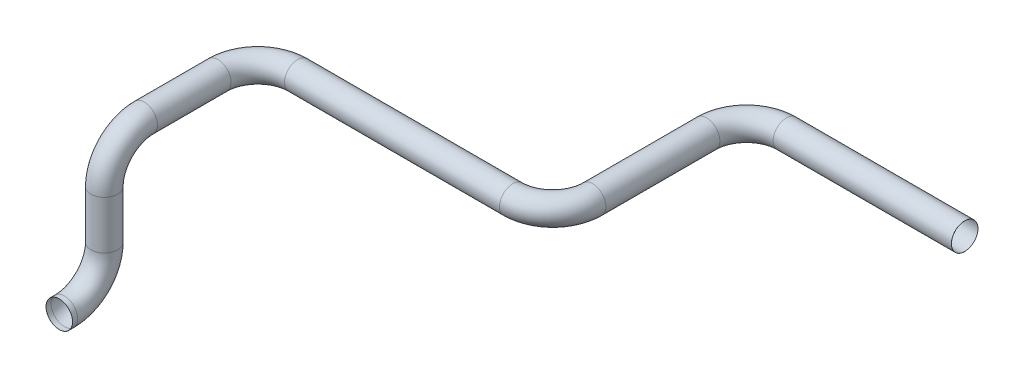
ISO-10303-21;
HEADER;
FILE_DESCRIPTION(('STEP AP214'),'2;1');
FILE_NAME('part.step','',(''),(''),'','','');
FILE_SCHEMA(('AUTOMOTIVE_DESIGN { 1 0 10303 214 1 1 1 1 }'));
ENDSEC;
DATA;
#1=APPLICATION_CONTEXT('core data for automotive mechanical design processes');
#2=APPLICATION_PROTOCOL_DEFINITION('international standard','automotive_design',2000,#1);
#3=PRODUCT_CONTEXT('',#1,'mechanical');
#4=PRODUCT('Part','Part','',(#3));
#5=PRODUCT_RELATED_PRODUCT_CATEGORY('part','',(#4));
#6=PRODUCT_DEFINITION_FORMATION('','',#4);
#7=PRODUCT_DEFINITION_CONTEXT('part definition',#1,'design');
#8=PRODUCT_DEFINITION('design','',#6,#7);
#9=PRODUCT_DEFINITION_SHAPE('','',#8);
#10=(LENGTH_UNIT() NAMED_UNIT(*) SI_UNIT(.MILLI.,.METRE.));
#11=(NAMED_UNIT(*) PLANE_ANGLE_UNIT() SI_UNIT($,.RADIAN.));
#12=(NAMED_UNIT(*) SI_UNIT($,.STERADIAN.) SOLID_ANGLE_UNIT());
#13=UNCERTAINTY_MEASURE_WITH_UNIT(LENGTH_MEASURE(1.E-05),#10,'distance_accuracy_value','');
#14=(GEOMETRIC_REPRESENTATION_CONTEXT(3) GLOBAL_UNCERTAINTY_ASSIGNED_CONTEXT((#13)) GLOBAL_UNIT_ASSIGNED_CONTEXT((#10,
#11,#12)) REPRESENTATION_CONTEXT('',''));
#15=CARTESIAN_POINT('',(0.,0.,0.));
#16=DIRECTION('',(0.,0.,1.));
#17=DIRECTION('',(1.,0.,0.));
#18=AXIS2_PLACEMENT_3D('',#15,#16,#17);
#19=CARTESIAN_POINT('',(0.,0.,0.));
#20=DIRECTION('',(0.,0.,1.));
#21=DIRECTION('',(1.,0.,0.));
#22=AXIS2_PLACEMENT_3D('',#19,#20,#21);
#23=PLANE('',#22);
#24=CARTESIAN_POINT('',(0.,0.,0.));
#25=DIRECTION('',(0.,0.,1.));
#26=DIRECTION('',(1.,0.,0.));
#27=AXIS2_PLACEMENT_3D('',#24,#25,#26);
#28=CIRCLE('',#27,4.99);
#29=CARTESIAN_POINT('',(4.99,0.,0.));
#30=VERTEX_POINT('',#29);
#31=EDGE_CURVE('E96',#30,#30,#28,.T.);
#32=ORIENTED_EDGE('',*,*,#31,.F.);
#33=EDGE_LOOP('',(#32));
#34=FACE_BOUND('',#33,.T.);
#35=CARTESIAN_POINT('',(0.,0.,0.));
#36=DIRECTION('',(0.,0.,1.));
#37=DIRECTION('',(1.,0.,0.));
#38=AXIS2_PLACEMENT_3D('',#35,#36,#37);
#39=CIRCLE('',#38,5.);
#40=CARTESIAN_POINT('',(5.,0.,0.));
#41=VERTEX_POINT('',#40);
#42=EDGE_CURVE('E89',#41,#41,#39,.T.);
#43=ORIENTED_EDGE('',*,*,#42,.T.);
#44=EDGE_LOOP('',(#43));
#45=FACE_BOUND('',#44,.T.);
#46=ADVANCED_FACE('F49',(#34,#45),#23,.T.);
#47=CARTESIAN_POINT('',(192.816056144563,48.1054397973253,-147.422083171506));
#48=DIRECTION('',(-1.,0.,0.));
#49=DIRECTION('',(0.,0.,1.));
#50=AXIS2_PLACEMENT_3D('',#47,#48,#49);
#51=PLANE('',#50);
#52=CARTESIAN_POINT('',(192.816056144563,48.1054397973253,-147.422083171506));
#53=DIRECTION('',(-1.,0.,0.));
#54=DIRECTION('',(0.,0.,1.));
#55=AXIS2_PLACEMENT_3D('',#52,#53,#54);
#56=CIRCLE('',#55,4.99);
#57=CARTESIAN_POINT('',(192.816056144563,48.1054397973253,-142.432083171506));
#58=VERTEX_POINT('',#57);
#59=EDGE_CURVE('E92',#58,#58,#56,.T.);
#60=ORIENTED_EDGE('',*,*,#59,.T.);
#61=EDGE_LOOP('',(#60));
#62=FACE_BOUND('',#61,.T.);
#63=CARTESIAN_POINT('',(192.816056144563,48.1054397973253,-147.422083171506));
#64=DIRECTION('',(-1.,0.,0.));
#65=DIRECTION('',(0.,0.,1.));
#66=AXIS2_PLACEMENT_3D('',#63,#64,#65);
#67=CIRCLE('',#66,5.);
#68=CARTESIAN_POINT('',(192.816056144563,48.1054397973253,-142.422083171506));
#69=VERTEX_POINT('',#68);
#70=EDGE_CURVE('E11',#69,#69,#67,.T.);
#71=ORIENTED_EDGE('',*,*,#70,.F.);
#72=EDGE_LOOP('',(#71));
#73=FACE_BOUND('',#72,.T.);
#74=ADVANCED_FACE('F140',(#62,#73),#51,.F.);
#75=CARTESIAN_POINT('',(0.,0.,0.));
#76=DIRECTION('',(0.,0.,-1.));
#77=DIRECTION('',(-1.,0.,0.));
#78=AXIS2_PLACEMENT_3D('',#75,#76,#77);
#79=CYLINDRICAL_SURFACE('',#78,5.);
#80=CARTESIAN_POINT('',(0.,0.,-1.91420702448455));
#81=DIRECTION('',(0.,0.,1.));
#82=DIRECTION('',(1.,0.,0.));
#83=AXIS2_PLACEMENT_3D('',#80,#81,#82);
#84=CIRCLE('',#83,5.);
#85=CARTESIAN_POINT('',(0.,-5.,-1.91420702448456));
#86=VERTEX_POINT('',#85);
#87=EDGE_CURVE('E86',#86,#86,#84,.T.);
#88=ORIENTED_EDGE('',*,*,#87,.T.);
#89=EDGE_LOOP('',(#88));
#90=FACE_BOUND('',#89,.T.);
#91=ORIENTED_EDGE('',*,*,#42,.F.);
#92=EDGE_LOOP('',(#91));
#93=FACE_BOUND('',#92,.T.);
#94=ADVANCED_FACE('F144',(#90,#93),#79,.T.);
#95=CARTESIAN_POINT('',(0.,15.,-1.91420702448454));
#96=DIRECTION('',(1.,0.,0.));
#97=DIRECTION('',(0.,0.,-1.));
#98=AXIS2_PLACEMENT_3D('',#95,#96,#97);
#99=TOROIDAL_SURFACE('',#98,15.,5.);
#100=CARTESIAN_POINT('',(0.,15.,-16.9142070244845));
#101=DIRECTION('',(0.,-1.,0.));
#102=DIRECTION('',(1.,0.,0.));
#103=AXIS2_PLACEMENT_3D('',#100,#101,#102);
#104=CIRCLE('',#103,5.);
#105=CARTESIAN_POINT('',(0.,15.,-21.9142070244845));
#106=VERTEX_POINT('',#105);
#107=EDGE_CURVE('E83',#106,#106,#104,.T.);
#108=CARTESIAN_POINT('',(0.,15.,-1.91420702448454));
#109=DIRECTION('',(1.,0.,0.));
#110=DIRECTION('',(0.,0.,-1.));
#111=AXIS2_PLACEMENT_3D('',#108,#109,#110);
#112=CIRCLE('',#111,20.);
#113=EDGE_CURVE('',#86,#106,#112,.T.);
#114=ORIENTED_EDGE('',*,*,#87,.F.);
#115=ORIENTED_EDGE('',*,*,#107,.T.);
#116=ORIENTED_EDGE('',*,*,#113,.T.);
#117=ORIENTED_EDGE('',*,*,#113,.F.);
#118=EDGE_LOOP('',(#114,#116,#115,#117));
#119=FACE_BOUND('',#118,.T.);
#120=ADVANCED_FACE('F146',(#119),#99,.T.);
#121=CARTESIAN_POINT('',(0.,15.,-16.9142070244845));
#122=DIRECTION('',(0.,1.,0.));
#123=DIRECTION('',(0.,0.,1.));
#124=AXIS2_PLACEMENT_3D('',#121,#122,#123);
#125=CYLINDRICAL_SURFACE('',#124,5.);
#126=CARTESIAN_POINT('',(0.,33.1054397973253,-16.9142070244845));
#127=DIRECTION('',(0.,-1.,0.));
#128=DIRECTION('',(1.,0.,0.));
#129=AXIS2_PLACEMENT_3D('',#126,#127,#128);
#130=CIRCLE('',#129,5.);
#131=CARTESIAN_POINT('',(0.,33.1054397973253,-11.9142070244845));
#132=VERTEX_POINT('',#131);
#133=EDGE_CURVE('E80',#132,#132,#130,.T.);
#134=ORIENTED_EDGE('',*,*,#133,.T.);
#135=EDGE_LOOP('',(#134));
#136=FACE_BOUND('',#135,.T.);
#137=ORIENTED_EDGE('',*,*,#107,.F.);
#138=EDGE_LOOP('',(#137));
#139=FACE_BOUND('',#138,.T.);
#140=ADVANCED_FACE('F152',(#136,#139),#125,.T.);
#141=CARTESIAN_POINT('',(0.,33.1054397973253,-31.9142070244845));
#142=DIRECTION('',(-1.,0.,0.));
#143=DIRECTION('',(0.,0.,1.));
#144=AXIS2_PLACEMENT_3D('',#141,#142,#143);
#145=TOROIDAL_SURFACE('',#144,15.,5.);
#146=CARTESIAN_POINT('',(0.,48.1054397973253,-31.9142070244846));
#147=DIRECTION('',(0.,0.,1.));
#148=DIRECTION('',(1.,0.,0.));
#149=AXIS2_PLACEMENT_3D('',#146,#147,#148);
#150=CIRCLE('',#149,5.);
#151=CARTESIAN_POINT('',(0.,53.1054397973253,-31.9142070244846));
#152=VERTEX_POINT('',#151);
#153=EDGE_CURVE('E77',#152,#152,#150,.T.);
#154=CARTESIAN_POINT('',(0.,33.1054397973253,-31.9142070244845));
#155=DIRECTION('',(-1.,0.,0.));
#156=DIRECTION('',(0.,0.,1.));
#157=AXIS2_PLACEMENT_3D('',#154,#155,#156);
#158=CIRCLE('',#157,20.);
#159=EDGE_CURVE('',#132,#152,#158,.T.);
#160=ORIENTED_EDGE('',*,*,#133,.F.);
#161=ORIENTED_EDGE('',*,*,#153,.T.);
#162=ORIENTED_EDGE('',*,*,#159,.T.);
#163=ORIENTED_EDGE('',*,*,#159,.F.);
#164=EDGE_LOOP('',(#160,#162,#161,#163));
#165=FACE_BOUND('',#164,.T.);
#166=ADVANCED_FACE('F186',(#165),#145,.T.);
#167=CARTESIAN_POINT('',(0.,48.1054397973253,-31.9142070244846));
#168=DIRECTION('',(0.,0.,-1.));
#169=DIRECTION('',(-1.,0.,0.));
#170=AXIS2_PLACEMENT_3D('',#167,#168,#169);
#171=CYLINDRICAL_SURFACE('',#170,5.);
#172=CARTESIAN_POINT('',(0.,48.1054397973253,-59.6010028769888));
#173=DIRECTION('',(0.,0.,1.));
#174=DIRECTION('',(1.,0.,0.));
#175=AXIS2_PLACEMENT_3D('',#172,#173,#174);
#176=CIRCLE('',#175,5.);
#177=CARTESIAN_POINT('',(-5.,48.1054397973253,-59.6010028769888));
#178=VERTEX_POINT('',#177);
#179=EDGE_CURVE('E74',#178,#178,#176,.T.);
#180=ORIENTED_EDGE('',*,*,#179,.T.);
#181=EDGE_LOOP('',(#180));
#182=FACE_BOUND('',#181,.T.);
#183=ORIENTED_EDGE('',*,*,#153,.F.);
#184=EDGE_LOOP('',(#183));
#185=FACE_BOUND('',#184,.T.);
#186=ADVANCED_FACE('F182',(#182,#185),#171,.T.);
#187=CARTESIAN_POINT('',(15.,48.1054397973253,-59.6010028769888));
#188=DIRECTION('',(0.,-1.,0.));
#189=DIRECTION('',(0.,0.,-1.));
#190=AXIS2_PLACEMENT_3D('',#187,#188,#189);
#191=TOROIDAL_SURFACE('',#190,15.,5.);
#192=CARTESIAN_POINT('',(15.,48.1054397973253,-74.6010028769888));
#193=DIRECTION('',(-1.,0.,0.));
#194=DIRECTION('',(0.,0.,1.));
#195=AXIS2_PLACEMENT_3D('',#192,#193,#194);
#196=CIRCLE('',#195,5.);
#197=CARTESIAN_POINT('',(15.,48.1054397973253,-79.6010028769888));
#198=VERTEX_POINT('',#197);
#199=EDGE_CURVE('E71',#198,#198,#196,.T.);
#200=CARTESIAN_POINT('',(15.,48.1054397973253,-59.6010028769888));
#201=DIRECTION('',(0.,-1.,0.));
#202=DIRECTION('',(0.,0.,-1.));
#203=AXIS2_PLACEMENT_3D('',#200,#201,#202);
#204=CIRCLE('',#203,20.);
#205=EDGE_CURVE('',#178,#198,#204,.T.);
#206=ORIENTED_EDGE('',*,*,#179,.F.);
#207=ORIENTED_EDGE('',*,*,#199,.T.);
#208=ORIENTED_EDGE('',*,*,#205,.T.);
#209=ORIENTED_EDGE('',*,*,#205,.F.);
#210=EDGE_LOOP('',(#206,#208,#207,#209));
#211=FACE_BOUND('',#210,.T.);
#212=ADVANCED_FACE('F178',(#211),#191,.T.);
#213=CARTESIAN_POINT('',(15.,48.1054397973253,-74.6010028769888));
#214=DIRECTION('',(1.,0.,0.));
#215=DIRECTION('',(0.,0.,-1.));
#216=AXIS2_PLACEMENT_3D('',#213,#214,#215);
#217=CYLINDRICAL_SURFACE('',#216,5.);
#218=CARTESIAN_POINT('',(95.8233031125536,48.1054397973253,-74.6010028769888));
#219=DIRECTION('',(-1.,0.,0.));
#220=DIRECTION('',(0.,0.,1.));
#221=AXIS2_PLACEMENT_3D('',#218,#219,#220);
#222=CIRCLE('',#221,5.);
#223=CARTESIAN_POINT('',(95.8233031125536,48.1054397973253,-69.6010028769888));
#224=VERTEX_POINT('',#223);
#225=EDGE_CURVE('E68',#224,#224,#222,.T.);
#226=ORIENTED_EDGE('',*,*,#225,.T.);
#227=EDGE_LOOP('',(#226));
#228=FACE_BOUND('',#227,.T.);
#229=ORIENTED_EDGE('',*,*,#199,.F.);
#230=EDGE_LOOP('',(#229));
#231=FACE_BOUND('',#230,.T.);
#232=ADVANCED_FACE('F174',(#228,#231),#217,.T.);
#233=CARTESIAN_POINT('',(95.8233031125536,48.1054397973253,-89.6010028769888));
#234=DIRECTION('',(0.,1.,0.));
#235=DIRECTION('',(0.,0.,1.));
#236=AXIS2_PLACEMENT_3D('',#233,#234,#235);
#237=TOROIDAL_SURFACE('',#236,15.,5.);
#238=CARTESIAN_POINT('',(110.823303112554,48.1054397973253,-89.6010028769888));
#239=DIRECTION('',(0.,0.,1.));
#240=DIRECTION('',(1.,0.,0.));
#241=AXIS2_PLACEMENT_3D('',#238,#239,#240);
#242=CIRCLE('',#241,5.);
#243=CARTESIAN_POINT('',(115.823303112554,48.1054397973253,-89.6010028769888));
#244=VERTEX_POINT('',#243);
#245=EDGE_CURVE('E63',#244,#244,#242,.T.);
#246=CARTESIAN_POINT('',(95.8233031125536,48.1054397973253,-89.6010028769888));
#247=DIRECTION('',(0.,1.,0.));
#248=DIRECTION('',(0.,0.,1.));
#249=AXIS2_PLACEMENT_3D('',#246,#247,#248);
#250=CIRCLE('',#249,20.);
#251=EDGE_CURVE('',#224,#244,#250,.T.);
#252=ORIENTED_EDGE('',*,*,#225,.F.);
#253=ORIENTED_EDGE('',*,*,#245,.T.);
#254=ORIENTED_EDGE('',*,*,#251,.T.);
#255=ORIENTED_EDGE('',*,*,#251,.F.);
#256=EDGE_LOOP('',(#252,#254,#253,#255));
#257=FACE_BOUND('',#256,.T.);
#258=ADVANCED_FACE('F170',(#257),#237,.T.);
#259=CARTESIAN_POINT('',(110.823303112554,48.1054397973253,-89.6010028769888));
#260=DIRECTION('',(0.,0.,-1.));
#261=DIRECTION('',(-1.,0.,0.));
#262=AXIS2_PLACEMENT_3D('',#259,#260,#261);
#263=CYLINDRICAL_SURFACE('',#262,5.);
#264=CARTESIAN_POINT('',(110.823303112554,48.1054397973253,-132.422083171506));
#265=DIRECTION('',(0.,0.,1.));
#266=DIRECTION('',(1.,0.,0.));
#267=AXIS2_PLACEMENT_3D('',#264,#265,#266);
#268=CIRCLE('',#267,5.);
#269=CARTESIAN_POINT('',(105.823303112554,48.1054397973253,-132.422083171506));
#270=VERTEX_POINT('',#269);
#271=EDGE_CURVE('E59',#270,#270,#268,.T.);
#272=ORIENTED_EDGE('',*,*,#271,.T.);
#273=EDGE_LOOP('',(#272));
#274=FACE_BOUND('',#273,.T.);
#275=ORIENTED_EDGE('',*,*,#245,.F.);
#276=EDGE_LOOP('',(#275));
#277=FACE_BOUND('',#276,.T.);
#278=ADVANCED_FACE('F164',(#274,#277),#263,.T.);
#279=CARTESIAN_POINT('',(125.823303112554,48.1054397973253,-132.422083171506));
#280=DIRECTION('',(0.,-1.,0.));
#281=DIRECTION('',(0.,0.,-1.));
#282=AXIS2_PLACEMENT_3D('',#279,#280,#281);
#283=TOROIDAL_SURFACE('',#282,15.,5.);
#284=CARTESIAN_POINT('',(125.823303112554,48.1054397973253,-147.422083171506));
#285=DIRECTION('',(-1.,0.,0.));
#286=DIRECTION('',(0.,0.,1.));
#287=AXIS2_PLACEMENT_3D('',#284,#285,#286);
#288=CIRCLE('',#287,5.);
#289=CARTESIAN_POINT('',(125.823303112554,48.1054397973253,-152.422083171506));
#290=VERTEX_POINT('',#289);
#291=EDGE_CURVE('E55',#290,#290,#288,.T.);
#292=CARTESIAN_POINT('',(125.823303112554,48.1054397973253,-132.422083171506));
#293=DIRECTION('',(0.,-1.,0.));
#294=DIRECTION('',(0.,0.,-1.));
#295=AXIS2_PLACEMENT_3D('',#292,#293,#294);
#296=CIRCLE('',#295,20.);
#297=EDGE_CURVE('',#270,#290,#296,.T.);
#298=ORIENTED_EDGE('',*,*,#271,.F.);
#299=ORIENTED_EDGE('',*,*,#291,.T.);
#300=ORIENTED_EDGE('',*,*,#297,.T.);
#301=ORIENTED_EDGE('',*,*,#297,.F.);
#302=EDGE_LOOP('',(#298,#300,#299,#301));
#303=FACE_BOUND('',#302,.T.);
#304=ADVANCED_FACE('F159',(#303),#283,.T.);
#305=CARTESIAN_POINT('',(125.823303112554,48.1054397973253,-147.422083171506));
#306=DIRECTION('',(1.,0.,0.));
#307=DIRECTION('',(0.,0.,-1.));
#308=AXIS2_PLACEMENT_3D('',#305,#306,#307);
#309=CYLINDRICAL_SURFACE('',#308,5.);
#310=ORIENTED_EDGE('',*,*,#70,.T.);
#311=EDGE_LOOP('',(#310));
#312=FACE_BOUND('',#311,.T.);
#313=ORIENTED_EDGE('',*,*,#291,.F.);
#314=EDGE_LOOP('',(#313));
#315=FACE_BOUND('',#314,.T.);
#316=ADVANCED_FACE('F134',(#312,#315),#309,.T.);
#317=CARTESIAN_POINT('',(0.,0.,0.));
#318=DIRECTION('',(0.,0.,-1.));
#319=DIRECTION('',(-1.,0.,0.));
#320=AXIS2_PLACEMENT_3D('',#317,#318,#319);
#321=CYLINDRICAL_SURFACE('',#320,4.99);
#322=CARTESIAN_POINT('',(0.,0.,-1.91420702448455));
#323=DIRECTION('',(0.,0.,-1.));
#324=DIRECTION('',(-1.,0.,0.));
#325=AXIS2_PLACEMENT_3D('',#322,#323,#324);
#326=CIRCLE('',#325,4.99);
#327=CARTESIAN_POINT('',(0.,-4.99,-1.91420702448456));
#328=VERTEX_POINT('',#327);
#329=EDGE_CURVE('E99',#328,#328,#326,.F.);
#330=ORIENTED_EDGE('',*,*,#329,.F.);
#331=EDGE_LOOP('',(#330));
#332=FACE_BOUND('',#331,.T.);
#333=ORIENTED_EDGE('',*,*,#31,.T.);
#334=EDGE_LOOP('',(#333));
#335=FACE_BOUND('',#334,.T.);
#336=ADVANCED_FACE('F131',(#332,#335),#321,.F.);
#337=CARTESIAN_POINT('',(0.,15.,-1.91420702448454));
#338=DIRECTION('',(1.,0.,0.));
#339=DIRECTION('',(0.,0.,-1.));
#340=AXIS2_PLACEMENT_3D('',#337,#338,#339);
#341=TOROIDAL_SURFACE('',#340,15.,4.99);
#342=CARTESIAN_POINT('',(0.,15.,-16.9142070244845));
#343=DIRECTION('',(0.,-1.,0.));
#344=DIRECTION('',(0.,0.,-1.));
#345=AXIS2_PLACEMENT_3D('',#342,#343,#344);
#346=CIRCLE('',#345,4.99);
#347=CARTESIAN_POINT('',(0.,15.,-21.9042070244845));
#348=VERTEX_POINT('',#347);
#349=EDGE_CURVE('E123',#348,#348,#346,.T.);
#350=CARTESIAN_POINT('',(0.,15.,-1.91420702448454));
#351=DIRECTION('',(1.,0.,0.));
#352=DIRECTION('',(0.,0.,-1.));
#353=AXIS2_PLACEMENT_3D('',#350,#351,#352);
#354=CIRCLE('',#353,19.99);
#355=EDGE_CURVE('',#328,#348,#354,.T.);
#356=ORIENTED_EDGE('',*,*,#329,.T.);
#357=ORIENTED_EDGE('',*,*,#349,.F.);
#358=ORIENTED_EDGE('',*,*,#355,.T.);
#359=ORIENTED_EDGE('',*,*,#355,.F.);
#360=EDGE_LOOP('',(#356,#358,#357,#359));
#361=FACE_BOUND('',#360,.T.);
#362=ADVANCED_FACE('F129',(#361),#341,.F.);
#363=CARTESIAN_POINT('',(0.,15.,-16.9142070244845));
#364=DIRECTION('',(0.,1.,0.));
#365=DIRECTION('',(0.,0.,1.));
#366=AXIS2_PLACEMENT_3D('',#363,#364,#365);
#367=CYLINDRICAL_SURFACE('',#366,4.99);
#368=CARTESIAN_POINT('',(0.,33.1054397973253,-16.9142070244845));
#369=DIRECTION('',(0.,1.,0.));
#370=DIRECTION('',(0.,0.,1.));
#371=AXIS2_PLACEMENT_3D('',#368,#369,#370);
#372=CIRCLE('',#371,4.99);
#373=CARTESIAN_POINT('',(0.,33.1054397973253,-11.9242070244845));
#374=VERTEX_POINT('',#373);
#375=EDGE_CURVE('E120',#374,#374,#372,.F.);
#376=ORIENTED_EDGE('',*,*,#375,.F.);
#377=EDGE_LOOP('',(#376));
#378=FACE_BOUND('',#377,.T.);
#379=ORIENTED_EDGE('',*,*,#349,.T.);
#380=EDGE_LOOP('',(#379));
#381=FACE_BOUND('',#380,.T.);
#382=ADVANCED_FACE('F258',(#378,#381),#367,.F.);
#383=CARTESIAN_POINT('',(0.,33.1054397973253,-31.9142070244845));
#384=DIRECTION('',(-1.,0.,0.));
#385=DIRECTION('',(0.,0.,1.));
#386=AXIS2_PLACEMENT_3D('',#383,#384,#385);
#387=TOROIDAL_SURFACE('',#386,15.,4.99);
#388=CARTESIAN_POINT('',(0.,48.1054397973253,-31.9142070244846));
#389=DIRECTION('',(0.,0.,1.));
#390=DIRECTION('',(0.,-1.,0.));
#391=AXIS2_PLACEMENT_3D('',#388,#389,#390);
#392=CIRCLE('',#391,4.99);
#393=CARTESIAN_POINT('',(0.,53.0954397973253,-31.9142070244846));
#394=VERTEX_POINT('',#393);
#395=EDGE_CURVE('E117',#394,#394,#392,.T.);
#396=CARTESIAN_POINT('',(0.,33.1054397973253,-31.9142070244845));
#397=DIRECTION('',(-1.,0.,0.));
#398=DIRECTION('',(0.,0.,1.));
#399=AXIS2_PLACEMENT_3D('',#396,#397,#398);
#400=CIRCLE('',#399,19.99);
#401=EDGE_CURVE('',#374,#394,#400,.T.);
#402=ORIENTED_EDGE('',*,*,#375,.T.);
#403=ORIENTED_EDGE('',*,*,#395,.F.);
#404=ORIENTED_EDGE('',*,*,#401,.T.);
#405=ORIENTED_EDGE('',*,*,#401,.F.);
#406=EDGE_LOOP('',(#402,#404,#403,#405));
#407=FACE_BOUND('',#406,.T.);
#408=ADVANCED_FACE('F268',(#407),#387,.F.);
#409=CARTESIAN_POINT('',(0.,48.1054397973253,-31.9142070244846));
#410=DIRECTION('',(0.,0.,-1.));
#411=DIRECTION('',(-1.,0.,0.));
#412=AXIS2_PLACEMENT_3D('',#409,#410,#411);
#413=CYLINDRICAL_SURFACE('',#412,4.99);
#414=CARTESIAN_POINT('',(0.,48.1054397973253,-59.6010028769888));
#415=DIRECTION('',(0.,0.,-1.));
#416=DIRECTION('',(-1.,0.,0.));
#417=AXIS2_PLACEMENT_3D('',#414,#415,#416);
#418=CIRCLE('',#417,4.99);
#419=CARTESIAN_POINT('',(-4.99,48.1054397973253,-59.6010028769888));
#420=VERTEX_POINT('',#419);
#421=EDGE_CURVE('E114',#420,#420,#418,.F.);
#422=ORIENTED_EDGE('',*,*,#421,.F.);
#423=EDGE_LOOP('',(#422));
#424=FACE_BOUND('',#423,.T.);
#425=ORIENTED_EDGE('',*,*,#395,.T.);
#426=EDGE_LOOP('',(#425));
#427=FACE_BOUND('',#426,.T.);
#428=ADVANCED_FACE('F278',(#424,#427),#413,.F.);
#429=CARTESIAN_POINT('',(15.,48.1054397973253,-59.6010028769888));
#430=DIRECTION('',(0.,-1.,0.));
#431=DIRECTION('',(0.,0.,-1.));
#432=AXIS2_PLACEMENT_3D('',#429,#430,#431);
#433=TOROIDAL_SURFACE('',#432,15.,4.99);
#434=CARTESIAN_POINT('',(15.,48.1054397973253,-74.6010028769888));
#435=DIRECTION('',(-1.,0.,0.));
#436=DIRECTION('',(0.,0.,1.));
#437=AXIS2_PLACEMENT_3D('',#434,#435,#436);
#438=CIRCLE('',#437,4.99);
#439=CARTESIAN_POINT('',(15.,48.1054397973253,-79.5910028769888));
#440=VERTEX_POINT('',#439);
#441=EDGE_CURVE('E111',#440,#440,#438,.T.);
#442=CARTESIAN_POINT('',(15.,48.1054397973253,-59.6010028769888));
#443=DIRECTION('',(0.,-1.,0.));
#444=DIRECTION('',(0.,0.,-1.));
#445=AXIS2_PLACEMENT_3D('',#442,#443,#444);
#446=CIRCLE('',#445,19.99);
#447=EDGE_CURVE('',#420,#440,#446,.T.);
#448=ORIENTED_EDGE('',*,*,#421,.T.);
#449=ORIENTED_EDGE('',*,*,#441,.F.);
#450=ORIENTED_EDGE('',*,*,#447,.T.);
#451=ORIENTED_EDGE('',*,*,#447,.F.);
#452=EDGE_LOOP('',(#448,#450,#449,#451));
#453=FACE_BOUND('',#452,.T.);
#454=ADVANCED_FACE('F288',(#453),#433,.F.);
#455=CARTESIAN_POINT('',(15.,48.1054397973253,-74.6010028769888));
#456=DIRECTION('',(1.,0.,0.));
#457=DIRECTION('',(0.,0.,-1.));
#458=AXIS2_PLACEMENT_3D('',#455,#456,#457);
#459=CYLINDRICAL_SURFACE('',#458,4.99);
#460=CARTESIAN_POINT('',(95.8233031125536,48.1054397973253,-74.6010028769888));
#461=DIRECTION('',(1.,0.,0.));
#462=DIRECTION('',(0.,0.,-1.));
#463=AXIS2_PLACEMENT_3D('',#460,#461,#462);
#464=CIRCLE('',#463,4.99);
#465=CARTESIAN_POINT('',(95.8233031125536,48.1054397973253,-69.6110028769888));
#466=VERTEX_POINT('',#465);
#467=EDGE_CURVE('E108',#466,#466,#464,.F.);
#468=ORIENTED_EDGE('',*,*,#467,.F.);
#469=EDGE_LOOP('',(#468));
#470=FACE_BOUND('',#469,.T.);
#471=ORIENTED_EDGE('',*,*,#441,.T.);
#472=EDGE_LOOP('',(#471));
#473=FACE_BOUND('',#472,.T.);
#474=ADVANCED_FACE('F298',(#470,#473),#459,.F.);
#475=CARTESIAN_POINT('',(95.8233031125536,48.1054397973253,-89.6010028769888));
#476=DIRECTION('',(0.,1.,0.));
#477=DIRECTION('',(0.,0.,1.));
#478=AXIS2_PLACEMENT_3D('',#475,#476,#477);
#479=TOROIDAL_SURFACE('',#478,15.,4.99);
#480=CARTESIAN_POINT('',(110.823303112554,48.1054397973253,-89.6010028769888));
#481=DIRECTION('',(0.,0.,1.));
#482=DIRECTION('',(1.,0.,0.));
#483=AXIS2_PLACEMENT_3D('',#480,#481,#482);
#484=CIRCLE('',#483,4.99);
#485=CARTESIAN_POINT('',(115.813303112554,48.1054397973253,-89.6010028769888));
#486=VERTEX_POINT('',#485);
#487=EDGE_CURVE('E105',#486,#486,#484,.T.);
#488=CARTESIAN_POINT('',(95.8233031125536,48.1054397973253,-89.6010028769888));
#489=DIRECTION('',(0.,1.,0.));
#490=DIRECTION('',(0.,0.,1.));
#491=AXIS2_PLACEMENT_3D('',#488,#489,#490);
#492=CIRCLE('',#491,19.99);
#493=EDGE_CURVE('',#466,#486,#492,.T.);
#494=ORIENTED_EDGE('',*,*,#467,.T.);
#495=ORIENTED_EDGE('',*,*,#487,.F.);
#496=ORIENTED_EDGE('',*,*,#493,.T.);
#497=ORIENTED_EDGE('',*,*,#493,.F.);
#498=EDGE_LOOP('',(#494,#496,#495,#497));
#499=FACE_BOUND('',#498,.T.);
#500=ADVANCED_FACE('F308',(#499),#479,.F.);
#501=CARTESIAN_POINT('',(110.823303112554,48.1054397973253,-89.6010028769888));
#502=DIRECTION('',(0.,0.,-1.));
#503=DIRECTION('',(-1.,0.,0.));
#504=AXIS2_PLACEMENT_3D('',#501,#502,#503);
#505=CYLINDRICAL_SURFACE('',#504,4.99);
#506=CARTESIAN_POINT('',(110.823303112554,48.1054397973253,-132.422083171506));
#507=DIRECTION('',(0.,0.,-1.));
#508=DIRECTION('',(-1.,0.,0.));
#509=AXIS2_PLACEMENT_3D('',#506,#507,#508);
#510=CIRCLE('',#509,4.99);
#511=CARTESIAN_POINT('',(105.833303112554,48.1054397973253,-132.422083171506));
#512=VERTEX_POINT('',#511);
#513=EDGE_CURVE('E102',#512,#512,#510,.F.);
#514=ORIENTED_EDGE('',*,*,#513,.F.);
#515=EDGE_LOOP('',(#514));
#516=FACE_BOUND('',#515,.T.);
#517=ORIENTED_EDGE('',*,*,#487,.T.);
#518=EDGE_LOOP('',(#517));
#519=FACE_BOUND('',#518,.T.);
#520=ADVANCED_FACE('F318',(#516,#519),#505,.F.);
#521=CARTESIAN_POINT('',(125.823303112554,48.1054397973253,-132.422083171506));
#522=DIRECTION('',(0.,-1.,0.));
#523=DIRECTION('',(0.,0.,-1.));
#524=AXIS2_PLACEMENT_3D('',#521,#522,#523);
#525=TOROIDAL_SURFACE('',#524,15.,4.99);
#526=CARTESIAN_POINT('',(125.823303112554,48.1054397973253,-147.422083171506));
#527=DIRECTION('',(-1.,0.,0.));
#528=DIRECTION('',(0.,0.,1.));
#529=AXIS2_PLACEMENT_3D('',#526,#527,#528);
#530=CIRCLE('',#529,4.99);
#531=CARTESIAN_POINT('',(125.823303112554,48.1054397973253,-152.412083171506));
#532=VERTEX_POINT('',#531);
#533=EDGE_CURVE('E95',#532,#532,#530,.T.);
#534=CARTESIAN_POINT('',(125.823303112554,48.1054397973253,-132.422083171506));
#535=DIRECTION('',(0.,-1.,0.));
#536=DIRECTION('',(0.,0.,-1.));
#537=AXIS2_PLACEMENT_3D('',#534,#535,#536);
#538=CIRCLE('',#537,19.99);
#539=EDGE_CURVE('',#512,#532,#538,.T.);
#540=ORIENTED_EDGE('',*,*,#513,.T.);
#541=ORIENTED_EDGE('',*,*,#533,.F.);
#542=ORIENTED_EDGE('',*,*,#539,.T.);
#543=ORIENTED_EDGE('',*,*,#539,.F.);
#544=EDGE_LOOP('',(#540,#542,#541,#543));
#545=FACE_BOUND('',#544,.T.);
#546=ADVANCED_FACE('F328',(#545),#525,.F.);
#547=CARTESIAN_POINT('',(125.823303112554,48.1054397973253,-147.422083171506));
#548=DIRECTION('',(1.,0.,0.));
#549=DIRECTION('',(0.,0.,-1.));
#550=AXIS2_PLACEMENT_3D('',#547,#548,#549);
#551=CYLINDRICAL_SURFACE('',#550,4.99);
#552=ORIENTED_EDGE('',*,*,#59,.F.);
#553=EDGE_LOOP('',(#552));
#554=FACE_BOUND('',#553,.T.);
#555=ORIENTED_EDGE('',*,*,#533,.T.);
#556=EDGE_LOOP('',(#555));
#557=FACE_BOUND('',#556,.T.);
#558=ADVANCED_FACE('F141',(#554,#557),#551,.F.);
#559=CLOSED_SHELL('',(#46,#74,#94,#120,#140,#166,#186,#212,#232,#258,#278,#304,#316,#336,#362,
#382,#408,#428,#454,#474,#500,#520,#546,#558));
#560=MANIFOLD_SOLID_BREP('B2',#559);
#561=ADVANCED_BREP_SHAPE_REPRESENTATION('',(#18,#560),#14);
#562=SHAPE_DEFINITION_REPRESENTATION(#9,#561);
ENDSEC;
END-ISO-10303-21;
